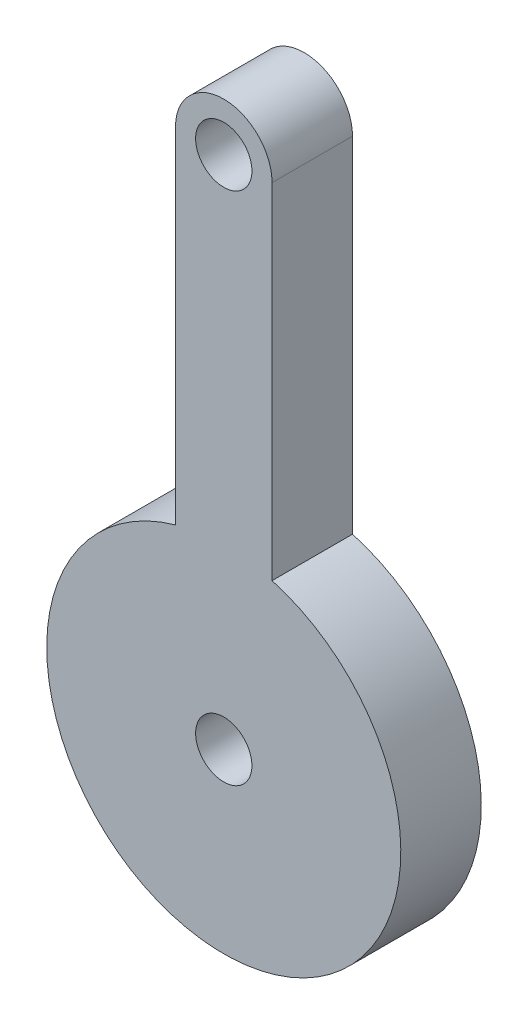
ISO-10303-21;
HEADER;
FILE_DESCRIPTION(('STEP AP214'),'2;1');
FILE_NAME('part.step','',(''),(''),'','','');
FILE_SCHEMA(('AUTOMOTIVE_DESIGN { 1 0 10303 214 1 1 1 1 }'));
ENDSEC;
DATA;
#1=APPLICATION_CONTEXT('core data for automotive mechanical design processes');
#2=APPLICATION_PROTOCOL_DEFINITION('international standard','automotive_design',2000,#1);
#3=PRODUCT_CONTEXT('',#1,'mechanical');
#4=PRODUCT('Part','Part','',(#3));
#5=PRODUCT_RELATED_PRODUCT_CATEGORY('part','',(#4));
#6=PRODUCT_DEFINITION_FORMATION('','',#4);
#7=PRODUCT_DEFINITION_CONTEXT('part definition',#1,'design');
#8=PRODUCT_DEFINITION('design','',#6,#7);
#9=PRODUCT_DEFINITION_SHAPE('','',#8);
#10=(LENGTH_UNIT() NAMED_UNIT(*) SI_UNIT(.MILLI.,.METRE.));
#11=(NAMED_UNIT(*) PLANE_ANGLE_UNIT() SI_UNIT($,.RADIAN.));
#12=(NAMED_UNIT(*) SI_UNIT($,.STERADIAN.) SOLID_ANGLE_UNIT());
#13=UNCERTAINTY_MEASURE_WITH_UNIT(LENGTH_MEASURE(1.E-05),#10,'distance_accuracy_value','');
#14=(GEOMETRIC_REPRESENTATION_CONTEXT(3) GLOBAL_UNCERTAINTY_ASSIGNED_CONTEXT((#13)) GLOBAL_UNIT_ASSIGNED_CONTEXT((#10,
#11,#12)) REPRESENTATION_CONTEXT('',''));
#15=CARTESIAN_POINT('',(0.,0.,0.));
#16=DIRECTION('',(0.,0.,1.));
#17=DIRECTION('',(1.,0.,0.));
#18=AXIS2_PLACEMENT_3D('',#15,#16,#17);
#19=CARTESIAN_POINT('',(20.0606397600353,-4.38449368241703,2.5));
#20=DIRECTION('',(0.,0.,1.));
#21=DIRECTION('',(1.,0.,0.));
#22=AXIS2_PLACEMENT_3D('',#19,#20,#21);
#23=PLANE('',#22);
#24=CARTESIAN_POINT('',(20.0606397600353,-36.384493682417,2.5));
#25=DIRECTION('',(0.,0.,1.));
#26=DIRECTION('',(1.,0.,0.));
#27=AXIS2_PLACEMENT_3D('',#24,#25,#26);
#28=CIRCLE('',#27,1.75);
#29=CARTESIAN_POINT('',(21.8106397600353,-36.384493682417,2.5));
#30=VERTEX_POINT('',#29);
#31=EDGE_CURVE('E98',#30,#30,#28,.T.);
#32=ORIENTED_EDGE('',*,*,#31,.F.);
#33=EDGE_LOOP('',(#32));
#34=FACE_BOUND('',#33,.T.);
#35=CARTESIAN_POINT('',(20.0606397600353,-4.38449368241703,2.5));
#36=DIRECTION('',(0.,0.,1.));
#37=DIRECTION('',(1.,0.,0.));
#38=AXIS2_PLACEMENT_3D('',#35,#36,#37);
#39=CIRCLE('',#38,3.);
#40=CARTESIAN_POINT('',(23.0606397600353,-4.38449368241703,2.5));
#41=VERTEX_POINT('',#40);
#42=CARTESIAN_POINT('',(17.0606397600353,-4.38449368241703,2.5));
#43=VERTEX_POINT('',#42);
#44=EDGE_CURVE('E83',#41,#43,#39,.T.);
#45=ORIENTED_EDGE('',*,*,#44,.T.);
#46=DIRECTION('',(0.,-1.,0.));
#47=VECTOR('',#46,1.);
#48=CARTESIAN_POINT('',(17.0606397600353,-4.38449368241703,2.5));
#49=LINE('',#48,#47);
#50=CARTESIAN_POINT('',(17.0606397600353,-25.8014884381587,2.5));
#51=VERTEX_POINT('',#50);
#52=EDGE_CURVE('E78',#43,#51,#49,.T.);
#53=ORIENTED_EDGE('',*,*,#52,.T.);
#54=CARTESIAN_POINT('',(20.0606397600353,-36.384493682417,2.5));
#55=DIRECTION('',(0.,0.,1.));
#56=DIRECTION('',(1.,0.,0.));
#57=AXIS2_PLACEMENT_3D('',#54,#55,#56);
#58=CIRCLE('',#57,11.);
#59=CARTESIAN_POINT('',(23.0606397600353,-25.8014884381587,2.5));
#60=VERTEX_POINT('',#59);
#61=EDGE_CURVE('E81',#51,#60,#58,.T.);
#62=ORIENTED_EDGE('',*,*,#61,.T.);
#63=DIRECTION('',(0.,1.,0.));
#64=VECTOR('',#63,1.);
#65=CARTESIAN_POINT('',(23.0606397600353,-4.38449368241703,2.5));
#66=LINE('',#65,#64);
#67=EDGE_CURVE('E48',#60,#41,#66,.T.);
#68=ORIENTED_EDGE('',*,*,#67,.T.);
#69=EDGE_LOOP('',(#45,#53,#62,#68));
#70=FACE_BOUND('',#69,.T.);
#71=CARTESIAN_POINT('',(20.0606397600353,-4.38449368241703,2.5));
#72=DIRECTION('',(0.,0.,1.));
#73=DIRECTION('',(1.,0.,0.));
#74=AXIS2_PLACEMENT_3D('',#71,#72,#73);
#75=CIRCLE('',#74,1.75);
#76=CARTESIAN_POINT('',(21.8106397600353,-4.38449368241703,2.5));
#77=VERTEX_POINT('',#76);
#78=EDGE_CURVE('E113',#77,#77,#75,.T.);
#79=ORIENTED_EDGE('',*,*,#78,.F.);
#80=EDGE_LOOP('',(#79));
#81=FACE_BOUND('',#80,.T.);
#82=ADVANCED_FACE('F31',(#34,#70,#81),#23,.T.);
#83=CARTESIAN_POINT('',(20.0606397600353,-4.38449368241703,-2.5));
#84=DIRECTION('',(0.,0.,1.));
#85=DIRECTION('',(1.,0.,0.));
#86=AXIS2_PLACEMENT_3D('',#83,#84,#85);
#87=PLANE('',#86);
#88=CARTESIAN_POINT('',(20.0606397600353,-36.384493682417,-2.5));
#89=DIRECTION('',(0.,0.,1.));
#90=DIRECTION('',(1.,0.,0.));
#91=AXIS2_PLACEMENT_3D('',#88,#89,#90);
#92=CIRCLE('',#91,1.75);
#93=CARTESIAN_POINT('',(21.8106397600353,-36.384493682417,-2.5));
#94=VERTEX_POINT('',#93);
#95=EDGE_CURVE('E110',#94,#94,#92,.T.);
#96=ORIENTED_EDGE('',*,*,#95,.T.);
#97=EDGE_LOOP('',(#96));
#98=FACE_BOUND('',#97,.T.);
#99=CARTESIAN_POINT('',(20.0606397600353,-4.38449368241703,-2.5));
#100=DIRECTION('',(0.,0.,1.));
#101=DIRECTION('',(1.,0.,0.));
#102=AXIS2_PLACEMENT_3D('',#99,#100,#101);
#103=CIRCLE('',#102,3.);
#104=CARTESIAN_POINT('',(23.0606397600353,-4.38449368241703,-2.5));
#105=VERTEX_POINT('',#104);
#106=CARTESIAN_POINT('',(17.0606397600353,-4.38449368241703,-2.5));
#107=VERTEX_POINT('',#106);
#108=EDGE_CURVE('E95',#105,#107,#103,.T.);
#109=ORIENTED_EDGE('',*,*,#108,.F.);
#110=DIRECTION('',(0.,1.,0.));
#111=VECTOR('',#110,1.);
#112=CARTESIAN_POINT('',(23.0606397600353,-4.38449368241703,-2.5));
#113=LINE('',#112,#111);
#114=CARTESIAN_POINT('',(23.0606397600353,-25.8014884381587,-2.5));
#115=VERTEX_POINT('',#114);
#116=EDGE_CURVE('E71',#115,#105,#113,.T.);
#117=ORIENTED_EDGE('',*,*,#116,.F.);
#118=CARTESIAN_POINT('',(20.0606397600353,-36.384493682417,-2.5));
#119=DIRECTION('',(0.,0.,1.));
#120=DIRECTION('',(1.,0.,0.));
#121=AXIS2_PLACEMENT_3D('',#118,#119,#120);
#122=CIRCLE('',#121,11.);
#123=CARTESIAN_POINT('',(17.0606397600353,-25.8014884381587,-2.5));
#124=VERTEX_POINT('',#123);
#125=EDGE_CURVE('E65',#124,#115,#122,.T.);
#126=ORIENTED_EDGE('',*,*,#125,.F.);
#127=DIRECTION('',(0.,-1.,0.));
#128=VECTOR('',#127,1.);
#129=CARTESIAN_POINT('',(17.0606397600353,-4.38449368241703,-2.5));
#130=LINE('',#129,#128);
#131=EDGE_CURVE('E87',#107,#124,#130,.T.);
#132=ORIENTED_EDGE('',*,*,#131,.F.);
#133=EDGE_LOOP('',(#109,#117,#126,#132));
#134=FACE_BOUND('',#133,.T.);
#135=CARTESIAN_POINT('',(20.0606397600353,-4.38449368241703,-2.5));
#136=DIRECTION('',(0.,0.,1.));
#137=DIRECTION('',(1.,0.,0.));
#138=AXIS2_PLACEMENT_3D('',#135,#136,#137);
#139=CIRCLE('',#138,1.75);
#140=CARTESIAN_POINT('',(21.8106397600353,-4.38449368241703,-2.5));
#141=VERTEX_POINT('',#140);
#142=EDGE_CURVE('E116',#141,#141,#139,.T.);
#143=ORIENTED_EDGE('',*,*,#142,.T.);
#144=EDGE_LOOP('',(#143));
#145=FACE_BOUND('',#144,.T.);
#146=ADVANCED_FACE('F106',(#98,#134,#145),#87,.F.);
#147=CARTESIAN_POINT('',(20.0606397600353,-4.38449368241703,2.5));
#148=DIRECTION('',(0.,0.,-1.));
#149=DIRECTION('',(-1.,0.,0.));
#150=AXIS2_PLACEMENT_3D('',#147,#148,#149);
#151=CYLINDRICAL_SURFACE('',#150,3.);
#152=ORIENTED_EDGE('',*,*,#108,.T.);
#153=DIRECTION('',(0.,0.,-1.));
#154=VECTOR('',#153,1.);
#155=CARTESIAN_POINT('',(17.0606397600353,-4.38449368241703,2.5));
#156=LINE('',#155,#154);
#157=EDGE_CURVE('E11',#43,#107,#156,.T.);
#158=ORIENTED_EDGE('',*,*,#157,.F.);
#159=ORIENTED_EDGE('',*,*,#44,.F.);
#160=DIRECTION('',(0.,0.,-1.));
#161=VECTOR('',#160,1.);
#162=CARTESIAN_POINT('',(23.0606397600353,-4.38449368241703,2.5));
#163=LINE('',#162,#161);
#164=EDGE_CURVE('E91',#41,#105,#163,.T.);
#165=ORIENTED_EDGE('',*,*,#164,.T.);
#166=EDGE_LOOP('',(#152,#158,#159,#165));
#167=FACE_BOUND('',#166,.T.);
#168=ADVANCED_FACE('F33',(#167),#151,.T.);
#169=CARTESIAN_POINT('',(17.0606397600353,-4.38449368241703,2.5));
#170=DIRECTION('',(1.,0.,0.));
#171=DIRECTION('',(0.,0.,-1.));
#172=AXIS2_PLACEMENT_3D('',#169,#170,#171);
#173=PLANE('',#172);
#174=ORIENTED_EDGE('',*,*,#131,.T.);
#175=DIRECTION('',(0.,0.,-1.));
#176=VECTOR('',#175,1.);
#177=CARTESIAN_POINT('',(17.0606397600353,-25.8014884381587,2.5));
#178=LINE('',#177,#176);
#179=EDGE_CURVE('E40',#51,#124,#178,.T.);
#180=ORIENTED_EDGE('',*,*,#179,.F.);
#181=ORIENTED_EDGE('',*,*,#52,.F.);
#182=ORIENTED_EDGE('',*,*,#157,.T.);
#183=EDGE_LOOP('',(#174,#180,#181,#182));
#184=FACE_BOUND('',#183,.T.);
#185=ADVANCED_FACE('F86',(#184),#173,.F.);
#186=CARTESIAN_POINT('',(20.0606397600353,-36.384493682417,2.5));
#187=DIRECTION('',(0.,0.,-1.));
#188=DIRECTION('',(-1.,0.,0.));
#189=AXIS2_PLACEMENT_3D('',#186,#187,#188);
#190=CYLINDRICAL_SURFACE('',#189,11.);
#191=ORIENTED_EDGE('',*,*,#125,.T.);
#192=DIRECTION('',(0.,0.,-1.));
#193=VECTOR('',#192,1.);
#194=CARTESIAN_POINT('',(23.0606397600353,-25.8014884381587,2.5));
#195=LINE('',#194,#193);
#196=EDGE_CURVE('E88',#60,#115,#195,.T.);
#197=ORIENTED_EDGE('',*,*,#196,.F.);
#198=ORIENTED_EDGE('',*,*,#61,.F.);
#199=ORIENTED_EDGE('',*,*,#179,.T.);
#200=EDGE_LOOP('',(#191,#197,#198,#199));
#201=FACE_BOUND('',#200,.T.);
#202=ADVANCED_FACE('F89',(#201),#190,.T.);
#203=CARTESIAN_POINT('',(23.0606397600353,-4.38449368241703,2.5));
#204=DIRECTION('',(-1.,0.,0.));
#205=DIRECTION('',(0.,0.,1.));
#206=AXIS2_PLACEMENT_3D('',#203,#204,#205);
#207=PLANE('',#206);
#208=ORIENTED_EDGE('',*,*,#116,.T.);
#209=ORIENTED_EDGE('',*,*,#164,.F.);
#210=ORIENTED_EDGE('',*,*,#67,.F.);
#211=ORIENTED_EDGE('',*,*,#196,.T.);
#212=EDGE_LOOP('',(#208,#209,#210,#211));
#213=FACE_BOUND('',#212,.T.);
#214=ADVANCED_FACE('F103',(#213),#207,.F.);
#215=CARTESIAN_POINT('',(20.0606397600353,-36.384493682417,2.5));
#216=DIRECTION('',(0.,0.,-1.));
#217=DIRECTION('',(-1.,0.,0.));
#218=AXIS2_PLACEMENT_3D('',#215,#216,#217);
#219=CYLINDRICAL_SURFACE('',#218,1.75);
#220=ORIENTED_EDGE('',*,*,#31,.T.);
#221=EDGE_LOOP('',(#220));
#222=FACE_BOUND('',#221,.T.);
#223=ORIENTED_EDGE('',*,*,#95,.F.);
#224=EDGE_LOOP('',(#223));
#225=FACE_BOUND('',#224,.T.);
#226=ADVANCED_FACE('F134',(#222,#225),#219,.F.);
#227=CARTESIAN_POINT('',(20.0606397600353,-4.38449368241703,2.5));
#228=DIRECTION('',(0.,0.,-1.));
#229=DIRECTION('',(-1.,0.,0.));
#230=AXIS2_PLACEMENT_3D('',#227,#228,#229);
#231=CYLINDRICAL_SURFACE('',#230,1.75);
#232=ORIENTED_EDGE('',*,*,#78,.T.);
#233=EDGE_LOOP('',(#232));
#234=FACE_BOUND('',#233,.T.);
#235=ORIENTED_EDGE('',*,*,#142,.F.);
#236=EDGE_LOOP('',(#235));
#237=FACE_BOUND('',#236,.T.);
#238=ADVANCED_FACE('F122',(#234,#237),#231,.F.);
#239=CLOSED_SHELL('',(#82,#146,#168,#185,#202,#214,#226,#238));
#240=MANIFOLD_SOLID_BREP('B2',#239);
#241=ADVANCED_BREP_SHAPE_REPRESENTATION('',(#18,#240),#14);
#242=SHAPE_DEFINITION_REPRESENTATION(#9,#241);
ENDSEC;
END-ISO-10303-21;
